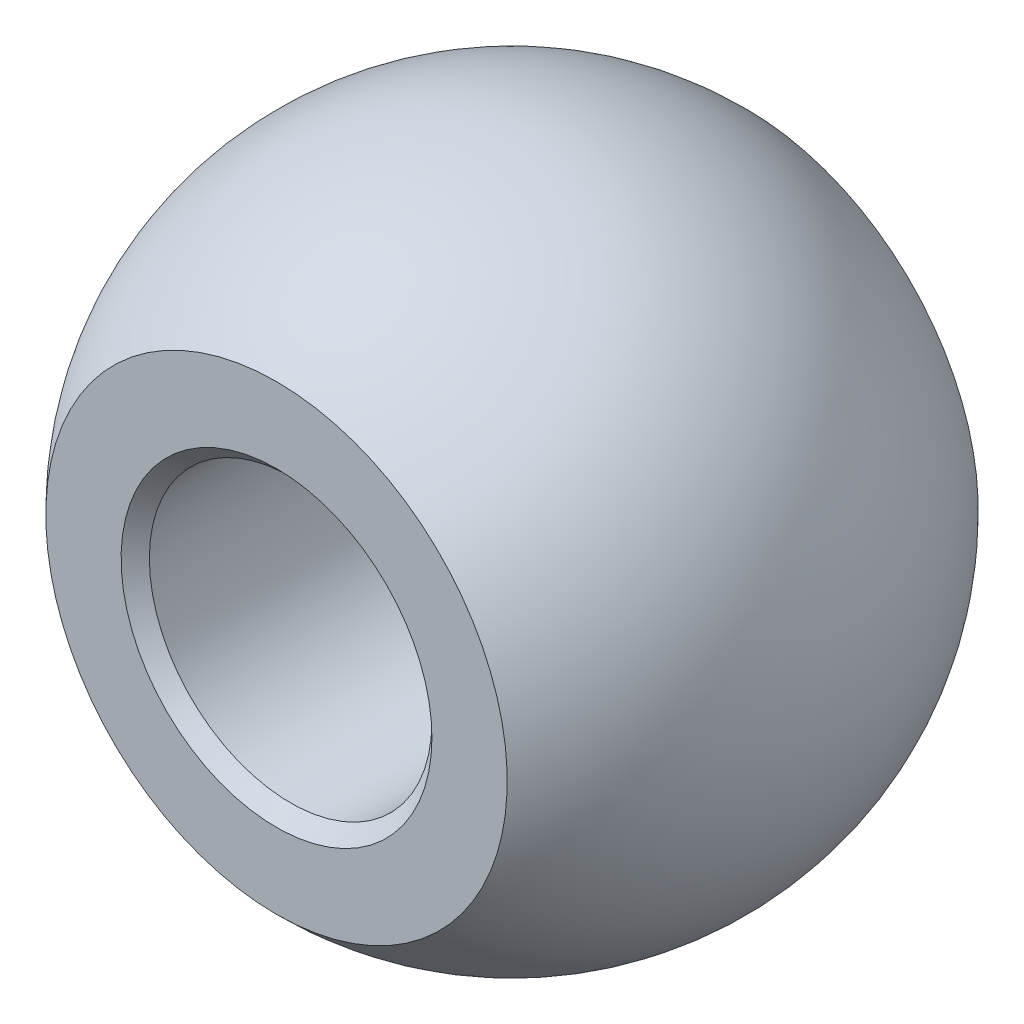
ISO-10303-21;
HEADER;
FILE_DESCRIPTION(('STEP AP214'),'2;1');
FILE_NAME('part.step','',(''),(''),'','','');
FILE_SCHEMA(('AUTOMOTIVE_DESIGN { 1 0 10303 214 1 1 1 1 }'));
ENDSEC;
DATA;
#1=APPLICATION_CONTEXT('core data for automotive mechanical design processes');
#2=APPLICATION_PROTOCOL_DEFINITION('international standard','automotive_design',2000,#1);
#3=PRODUCT_CONTEXT('',#1,'mechanical');
#4=PRODUCT('Part','Part','',(#3));
#5=PRODUCT_RELATED_PRODUCT_CATEGORY('part','',(#4));
#6=PRODUCT_DEFINITION_FORMATION('','',#4);
#7=PRODUCT_DEFINITION_CONTEXT('part definition',#1,'design');
#8=PRODUCT_DEFINITION('design','',#6,#7);
#9=PRODUCT_DEFINITION_SHAPE('','',#8);
#10=(LENGTH_UNIT() NAMED_UNIT(*) SI_UNIT(.MILLI.,.METRE.));
#11=(NAMED_UNIT(*) PLANE_ANGLE_UNIT() SI_UNIT($,.RADIAN.));
#12=(NAMED_UNIT(*) SI_UNIT($,.STERADIAN.) SOLID_ANGLE_UNIT());
#13=UNCERTAINTY_MEASURE_WITH_UNIT(LENGTH_MEASURE(1.E-05),#10,'distance_accuracy_value','');
#14=(GEOMETRIC_REPRESENTATION_CONTEXT(3) GLOBAL_UNCERTAINTY_ASSIGNED_CONTEXT((#13)) GLOBAL_UNIT_ASSIGNED_CONTEXT((#10,
#11,#12)) REPRESENTATION_CONTEXT('',''));
#15=CARTESIAN_POINT('',(0.,0.,0.));
#16=DIRECTION('',(0.,0.,1.));
#17=DIRECTION('',(1.,0.,0.));
#18=AXIS2_PLACEMENT_3D('',#15,#16,#17);
#19=CARTESIAN_POINT('',(0.,12.7,0.));
#20=DIRECTION('',(0.,-1.,0.));
#21=DIRECTION('',(-1.,0.,0.));
#22=AXIS2_PLACEMENT_3D('',#19,#20,#21);
#23=SPHERICAL_SURFACE('',#22,5.55625);
#24=CARTESIAN_POINT('',(0.,12.7,0.));
#25=DIRECTION('',(0.,0.,1.));
#26=DIRECTION('',(0.,-1.,0.));
#27=AXIS2_PLACEMENT_3D('',#24,#25,#26);
#28=SPHERICAL_SURFACE('',#27,5.55625);
#29=CARTESIAN_POINT('',(0.,12.7,-3.96875));
#30=DIRECTION('',(0.,0.,1.));
#31=DIRECTION('',(0.,-1.,0.));
#32=AXIS2_PLACEMENT_3D('',#29,#30,#31);
#33=CIRCLE('',#32,3.88856496666829);
#34=CARTESIAN_POINT('',(0.,8.81143503333171,-3.96875));
#35=VERTEX_POINT('',#34);
#36=EDGE_CURVE('E60',#35,#35,#33,.F.);
#37=ORIENTED_EDGE('',*,*,#36,.F.);
#38=EDGE_LOOP('',(#37));
#39=FACE_BOUND('',#38,.T.);
#40=CARTESIAN_POINT('',(0.,12.7,3.96875));
#41=DIRECTION('',(0.,0.,-1.));
#42=DIRECTION('',(0.,1.,0.));
#43=AXIS2_PLACEMENT_3D('',#40,#41,#42);
#44=CIRCLE('',#43,3.88856496666829);
#45=CARTESIAN_POINT('',(0.,16.5885649666683,3.96875));
#46=VERTEX_POINT('',#45);
#47=EDGE_CURVE('E59',#46,#46,#44,.F.);
#48=ORIENTED_EDGE('',*,*,#47,.F.);
#49=EDGE_LOOP('',(#48));
#50=FACE_BOUND('',#49,.T.);
#51=ADVANCED_FACE('F39',(#39,#50),#28,.T.);
#52=CARTESIAN_POINT('',(-7.9375,20.6375,3.96875));
#53=DIRECTION('',(0.,0.,-1.));
#54=DIRECTION('',(0.,1.,0.));
#55=AXIS2_PLACEMENT_3D('',#52,#53,#54);
#56=PLANE('',#55);
#57=CARTESIAN_POINT('',(0.,12.7,3.96875));
#58=DIRECTION('',(0.,0.,-1.));
#59=DIRECTION('',(0.,1.,0.));
#60=AXIS2_PLACEMENT_3D('',#57,#58,#59);
#61=CIRCLE('',#60,2.619375);
#62=CARTESIAN_POINT('',(0.,15.319375,3.96875));
#63=VERTEX_POINT('',#62);
#64=EDGE_CURVE('E11',#63,#63,#61,.T.);
#65=ORIENTED_EDGE('',*,*,#64,.T.);
#66=EDGE_LOOP('',(#65));
#67=FACE_BOUND('',#66,.T.);
#68=ORIENTED_EDGE('',*,*,#47,.T.);
#69=EDGE_LOOP('',(#68));
#70=FACE_BOUND('',#69,.T.);
#71=ADVANCED_FACE('F66',(#67,#70),#56,.F.);
#72=CARTESIAN_POINT('',(-7.9375,20.6375,-3.96875));
#73=DIRECTION('',(0.,0.,1.));
#74=DIRECTION('',(0.,-1.,0.));
#75=AXIS2_PLACEMENT_3D('',#72,#73,#74);
#76=PLANE('',#75);
#77=CARTESIAN_POINT('',(0.,12.7,-3.96875));
#78=DIRECTION('',(0.,0.,1.));
#79=DIRECTION('',(0.,-1.,0.));
#80=AXIS2_PLACEMENT_3D('',#77,#78,#79);
#81=CIRCLE('',#80,2.619375);
#82=CARTESIAN_POINT('',(0.,10.080625,-3.96875));
#83=VERTEX_POINT('',#82);
#84=EDGE_CURVE('E54',#83,#83,#81,.T.);
#85=ORIENTED_EDGE('',*,*,#84,.T.);
#86=EDGE_LOOP('',(#85));
#87=FACE_BOUND('',#86,.T.);
#88=ORIENTED_EDGE('',*,*,#36,.T.);
#89=EDGE_LOOP('',(#88));
#90=FACE_BOUND('',#89,.T.);
#91=ADVANCED_FACE('F74',(#87,#90),#76,.F.);
#92=CARTESIAN_POINT('',(0.,12.7,-3.96875));
#93=DIRECTION('',(0.,0.,1.));
#94=DIRECTION('',(1.,0.,0.));
#95=AXIS2_PLACEMENT_3D('',#92,#93,#94);
#96=CYLINDRICAL_SURFACE('',#95,2.38125);
#97=CARTESIAN_POINT('',(0.,12.7,-3.730625));
#98=DIRECTION('',(0.,0.,1.));
#99=DIRECTION('',(1.,0.,0.));
#100=AXIS2_PLACEMENT_3D('',#97,#98,#99);
#101=CIRCLE('',#100,2.38125);
#102=CARTESIAN_POINT('',(2.38125,12.7,-3.730625));
#103=VERTEX_POINT('',#102);
#104=EDGE_CURVE('E46',#103,#103,#101,.F.);
#105=ORIENTED_EDGE('',*,*,#104,.T.);
#106=EDGE_LOOP('',(#105));
#107=FACE_BOUND('',#106,.T.);
#108=CARTESIAN_POINT('',(0.,12.7,3.730625));
#109=DIRECTION('',(0.,0.,-1.));
#110=DIRECTION('',(-1.,0.,0.));
#111=AXIS2_PLACEMENT_3D('',#108,#109,#110);
#112=CIRCLE('',#111,2.38125);
#113=CARTESIAN_POINT('',(-2.38125,12.7,3.730625));
#114=VERTEX_POINT('',#113);
#115=EDGE_CURVE('E50',#114,#114,#112,.F.);
#116=ORIENTED_EDGE('',*,*,#115,.T.);
#117=EDGE_LOOP('',(#116));
#118=FACE_BOUND('',#117,.T.);
#119=ADVANCED_FACE('F80',(#107,#118),#96,.F.);
#120=CARTESIAN_POINT('',(0.,12.7,-3.96875));
#121=DIRECTION('',(0.,0.,-1.));
#122=DIRECTION('',(-1.,0.,0.));
#123=AXIS2_PLACEMENT_3D('',#120,#121,#122);
#124=CONICAL_SURFACE('',#123,2.619375,0.785398163397447);
#125=ORIENTED_EDGE('',*,*,#104,.F.);
#126=EDGE_LOOP('',(#125));
#127=FACE_BOUND('',#126,.T.);
#128=ORIENTED_EDGE('',*,*,#84,.F.);
#129=EDGE_LOOP('',(#128));
#130=FACE_BOUND('',#129,.T.);
#131=ADVANCED_FACE('F78',(#127,#130),#124,.F.);
#132=CARTESIAN_POINT('',(0.,12.7,3.730625));
#133=DIRECTION('',(0.,0.,1.));
#134=DIRECTION('',(1.,0.,0.));
#135=AXIS2_PLACEMENT_3D('',#132,#133,#134);
#136=CONICAL_SURFACE('',#135,2.38125,0.785398163397449);
#137=ORIENTED_EDGE('',*,*,#64,.F.);
#138=EDGE_LOOP('',(#137));
#139=FACE_BOUND('',#138,.T.);
#140=ORIENTED_EDGE('',*,*,#115,.F.);
#141=EDGE_LOOP('',(#140));
#142=FACE_BOUND('',#141,.T.);
#143=ADVANCED_FACE('F41',(#139,#142),#136,.F.);
#144=CLOSED_SHELL('',(#51,#71,#91,#119,#131,#143));
#145=MANIFOLD_SOLID_BREP('B2',#144);
#146=ADVANCED_BREP_SHAPE_REPRESENTATION('',(#18,#145),#14);
#147=SHAPE_DEFINITION_REPRESENTATION(#9,#146);
ENDSEC;
END-ISO-10303-21;
